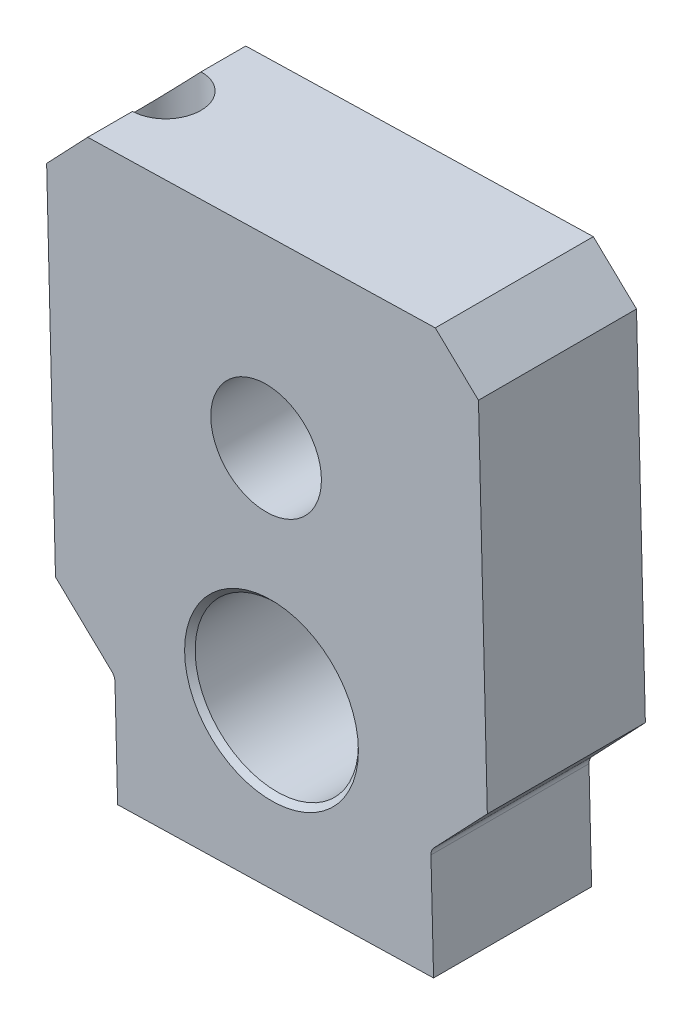
ISO-10303-21;
HEADER;
FILE_DESCRIPTION(('STEP AP214'),'2;1');
FILE_NAME('part.step','',(''),(''),'','','');
FILE_SCHEMA(('AUTOMOTIVE_DESIGN { 1 0 10303 214 1 1 1 1 }'));
ENDSEC;
DATA;
#1=APPLICATION_CONTEXT('core data for automotive mechanical design processes');
#2=APPLICATION_PROTOCOL_DEFINITION('international standard','automotive_design',2000,#1);
#3=PRODUCT_CONTEXT('',#1,'mechanical');
#4=PRODUCT('Part','Part','',(#3));
#5=PRODUCT_RELATED_PRODUCT_CATEGORY('part','',(#4));
#6=PRODUCT_DEFINITION_FORMATION('','',#4);
#7=PRODUCT_DEFINITION_CONTEXT('part definition',#1,'design');
#8=PRODUCT_DEFINITION('design','',#6,#7);
#9=PRODUCT_DEFINITION_SHAPE('','',#8);
#10=(LENGTH_UNIT() NAMED_UNIT(*) SI_UNIT(.MILLI.,.METRE.));
#11=(NAMED_UNIT(*) PLANE_ANGLE_UNIT() SI_UNIT($,.RADIAN.));
#12=(NAMED_UNIT(*) SI_UNIT($,.STERADIAN.) SOLID_ANGLE_UNIT());
#13=UNCERTAINTY_MEASURE_WITH_UNIT(LENGTH_MEASURE(1.E-05),#10,'distance_accuracy_value','');
#14=(GEOMETRIC_REPRESENTATION_CONTEXT(3) GLOBAL_UNCERTAINTY_ASSIGNED_CONTEXT((#13)) GLOBAL_UNIT_ASSIGNED_CONTEXT((#10,
#11,#12)) REPRESENTATION_CONTEXT('',''));
#15=CARTESIAN_POINT('',(0.,0.,0.));
#16=DIRECTION('',(0.,0.,1.));
#17=DIRECTION('',(1.,0.,0.));
#18=AXIS2_PLACEMENT_3D('',#15,#16,#17);
#19=CARTESIAN_POINT('',(0.,0.,15.));
#20=DIRECTION('',(0.,0.,-1.));
#21=DIRECTION('',(-1.,0.,0.));
#22=AXIS2_PLACEMENT_3D('',#19,#20,#21);
#23=CYLINDRICAL_SURFACE('',#22,5.25);
#24=CARTESIAN_POINT('',(0.,0.,15.));
#25=DIRECTION('',(0.,0.,1.));
#26=DIRECTION('',(1.,0.,0.));
#27=AXIS2_PLACEMENT_3D('',#24,#25,#26);
#28=CIRCLE('',#27,5.25);
#29=CARTESIAN_POINT('',(5.25,0.,15.));
#30=VERTEX_POINT('',#29);
#31=EDGE_CURVE('E418',#30,#30,#28,.T.);
#32=ORIENTED_EDGE('',*,*,#31,.T.);
#33=EDGE_LOOP('',(#32));
#34=FACE_BOUND('',#33,.T.);
#35=CARTESIAN_POINT('',(0.,0.,3.));
#36=DIRECTION('',(0.,0.,-1.));
#37=DIRECTION('',(-1.,0.,0.));
#38=AXIS2_PLACEMENT_3D('',#35,#36,#37);
#39=CIRCLE('',#38,5.25);
#40=CARTESIAN_POINT('',(-5.25,0.,3.));
#41=VERTEX_POINT('',#40);
#42=EDGE_CURVE('E160',#41,#41,#39,.T.);
#43=ORIENTED_EDGE('',*,*,#42,.T.);
#44=EDGE_LOOP('',(#43));
#45=FACE_BOUND('',#44,.T.);
#46=ADVANCED_FACE('F35',(#34,#45),#23,.F.);
#47=CARTESIAN_POINT('',(16.6452479800424,-25.5989320636449,15.));
#48=DIRECTION('',(0.,0.,1.));
#49=DIRECTION('',(1.,0.,0.));
#50=AXIS2_PLACEMENT_3D('',#47,#48,#49);
#51=PLANE('',#50);
#52=CARTESIAN_POINT('',(0.512556913680266,-20.4935913253493,15.));
#53=DIRECTION('',(0.,0.,1.));
#54=DIRECTION('',(1.,0.,0.));
#55=AXIS2_PLACEMENT_3D('',#52,#53,#54);
#56=CIRCLE('',#55,8.25000000000053);
#57=CARTESIAN_POINT('',(8.76255691368079,-20.4935913253493,15.));
#58=VERTEX_POINT('',#57);
#59=EDGE_CURVE('E181',#58,#58,#56,.F.);
#60=ORIENTED_EDGE('',*,*,#59,.T.);
#61=EDGE_LOOP('',(#60));
#62=FACE_BOUND('',#61,.T.);
#63=DIRECTION('',(-0.0250027762767222,0.999687381724135,0.));
#64=VECTOR('',#63,1.);
#65=CARTESIAN_POINT('',(20.9959694392361,-19.5740548992839,15.));
#66=LINE('',#65,#64);
#67=CARTESIAN_POINT('',(20.9959694392361,-19.5740548992839,15.));
#68=VERTEX_POINT('',#67);
#69=CARTESIAN_POINT('',(20.1560538455983,14.0083365671702,15.));
#70=VERTEX_POINT('',#69);
#71=EDGE_CURVE('E428',#68,#70,#66,.T.);
#72=ORIENTED_EDGE('',*,*,#71,.T.);
#73=DIRECTION('',(0.724565359337519,-0.689206094030002,0.));
#74=VECTOR('',#73,1.);
#75=CARTESIAN_POINT('',(38.091772734983,-3.05210746326916,15.));
#76=LINE('',#75,#74);
#77=CARTESIAN_POINT('',(16.0572932135961,17.9070749889587,15.));
#78=VERTEX_POINT('',#77);
#79=EDGE_CURVE('E170',#70,#78,#76,.F.);
#80=ORIENTED_EDGE('',*,*,#79,.T.);
#81=DIRECTION('',(-0.999687381724127,-0.0250027762770298,0.));
#82=VECTOR('',#81,1.);
#83=CARTESIAN_POINT('',(20.0560427404914,18.0070860940668,15.));
#84=LINE('',#83,#82);
#85=CARTESIAN_POINT('',(-16.9323903833129,17.0819833718164,15.));
#86=VERTEX_POINT('',#85);
#87=EDGE_CURVE('E432',#78,#86,#84,.T.);
#88=ORIENTED_EDGE('',*,*,#87,.T.);
#89=DIRECTION('',(0.689206094029778,0.724565359337732,0.));
#90=VECTOR('',#89,1.);
#91=CARTESIAN_POINT('',(-22.2966191483696,11.4425463784529,15.));
#92=LINE('',#91,#90);
#93=CARTESIAN_POINT('',(-20.8311288051013,12.9832227398118,15.));
#94=VERTEX_POINT('',#93);
#95=EDGE_CURVE('E151',#86,#94,#92,.F.);
#96=ORIENTED_EDGE('',*,*,#95,.T.);
#97=DIRECTION('',(0.0250027762770297,-0.999687381724127,0.));
#98=VECTOR('',#97,1.);
#99=CARTESIAN_POINT('',(-19.9912132114532,-20.5991687266389,15.));
#100=LINE('',#99,#98);
#101=CARTESIAN_POINT('',(-19.9912132114532,-20.5991687266389,15.));
#102=VERTEX_POINT('',#101);
#103=EDGE_CURVE('E434',#94,#102,#100,.T.);
#104=ORIENTED_EDGE('',*,*,#103,.T.);
#105=DIRECTION('',(0.724565359337678,-0.689206094029835,0.));
#106=VECTOR('',#105,1.);
#107=CARTESIAN_POINT('',(-14.6555421410993,-25.6744555451918,15.));
#108=LINE('',#107,#106);
#109=CARTESIAN_POINT('',(-14.6555421410993,-25.6744555451918,15.));
#110=VERTEX_POINT('',#109);
#111=EDGE_CURVE('E436',#102,#110,#108,.T.);
#112=ORIENTED_EDGE('',*,*,#111,.T.);
#113=CARTESIAN_POINT('',(-15.3447482351292,-26.3990209045295,15.));
#114=DIRECTION('',(0.,0.,-1.));
#115=DIRECTION('',(1.,0.,0.));
#116=AXIS2_PLACEMENT_3D('',#113,#114,#115);
#117=CIRCLE('',#116,1.);
#118=CARTESIAN_POINT('',(-14.345060853405,-26.3740181282526,15.));
#119=VERTEX_POINT('',#118);
#120=EDGE_CURVE('E438',#110,#119,#117,.T.);
#121=ORIENTED_EDGE('',*,*,#120,.T.);
#122=DIRECTION('',(0.0250027762769692,-0.999687381724129,0.));
#123=VECTOR('',#122,1.);
#124=CARTESIAN_POINT('',(-14.345060853405,-26.3740181282526,15.));
#125=LINE('',#124,#123);
#126=CARTESIAN_POINT('',(-14.0952107798901,-36.363787386228,15.));
#127=VERTEX_POINT('',#126);
#128=EDGE_CURVE('E440',#119,#127,#125,.T.);
#129=ORIENTED_EDGE('',*,*,#128,.T.);
#130=DIRECTION('',(0.999687381724129,0.0250027762769692,0.));
#131=VECTOR('',#130,1.);
#132=CARTESIAN_POINT('',(-14.0952107798901,-36.363787386228,15.));
#133=LINE('',#132,#131);
#134=CARTESIAN_POINT('',(15.8954106718337,-35.6137040979189,15.));
#135=VERTEX_POINT('',#134);
#136=EDGE_CURVE('E442',#127,#135,#133,.T.);
#137=ORIENTED_EDGE('',*,*,#136,.T.);
#138=DIRECTION('',(-0.0250027762769691,0.999687381724129,0.));
#139=VECTOR('',#138,1.);
#140=CARTESIAN_POINT('',(15.8954106718337,-35.6137040979189,15.));
#141=LINE('',#140,#139);
#142=CARTESIAN_POINT('',(15.6455605983183,-25.6239348399219,15.));
#143=VERTEX_POINT('',#142);
#144=EDGE_CURVE('E444',#135,#143,#141,.T.);
#145=ORIENTED_EDGE('',*,*,#144,.T.);
#146=CARTESIAN_POINT('',(16.6452479800424,-25.5989320636449,15.));
#147=DIRECTION('',(0.,0.,-1.));
#148=DIRECTION('',(1.,0.,0.));
#149=AXIS2_PLACEMENT_3D('',#146,#147,#148);
#150=CIRCLE('',#149,1.);
#151=CARTESIAN_POINT('',(15.9206826207047,-24.909725969615,15.));
#152=VERTEX_POINT('',#151);
#153=EDGE_CURVE('E446',#143,#152,#150,.T.);
#154=ORIENTED_EDGE('',*,*,#153,.T.);
#155=DIRECTION('',(0.689206094029835,0.724565359337678,0.));
#156=VECTOR('',#155,1.);
#157=CARTESIAN_POINT('',(20.9959694392361,-19.5740548992839,15.));
#158=LINE('',#157,#156);
#159=EDGE_CURVE('E425',#152,#68,#158,.T.);
#160=ORIENTED_EDGE('',*,*,#159,.T.);
#161=EDGE_LOOP('',(#72,#80,#88,#96,#104,#112,#121,#129,#137,#145,#154,#160));
#162=FACE_BOUND('',#161,.T.);
#163=ORIENTED_EDGE('',*,*,#31,.F.);
#164=EDGE_LOOP('',(#163));
#165=FACE_BOUND('',#164,.T.);
#166=ADVANCED_FACE('F201',(#62,#162,#165),#51,.T.);
#167=CARTESIAN_POINT('',(16.6452479800424,-25.5989320636449,0.));
#168=DIRECTION('',(0.,0.,1.));
#169=DIRECTION('',(1.,0.,0.));
#170=AXIS2_PLACEMENT_3D('',#167,#168,#169);
#171=PLANE('',#170);
#172=CARTESIAN_POINT('',(0.512556913680266,-20.4935913253493,0.));
#173=DIRECTION('',(0.,0.,1.));
#174=DIRECTION('',(1.,0.,0.));
#175=AXIS2_PLACEMENT_3D('',#172,#173,#174);
#176=CIRCLE('',#175,8.25000000000051);
#177=CARTESIAN_POINT('',(8.76255691368078,-20.4935913253493,0.));
#178=VERTEX_POINT('',#177);
#179=EDGE_CURVE('E44',#178,#178,#176,.T.);
#180=ORIENTED_EDGE('',*,*,#179,.T.);
#181=EDGE_LOOP('',(#180));
#182=FACE_BOUND('',#181,.T.);
#183=CARTESIAN_POINT('',(0.,0.,0.));
#184=DIRECTION('',(0.,0.,-1.));
#185=DIRECTION('',(-1.,0.,0.));
#186=AXIS2_PLACEMENT_3D('',#183,#184,#185);
#187=CIRCLE('',#186,11.15);
#188=CARTESIAN_POINT('',(-11.15,0.,0.));
#189=VERTEX_POINT('',#188);
#190=EDGE_CURVE('E416',#189,#189,#187,.T.);
#191=ORIENTED_EDGE('',*,*,#190,.F.);
#192=EDGE_LOOP('',(#191));
#193=FACE_BOUND('',#192,.T.);
#194=DIRECTION('',(-0.999687381724127,-0.0250027762770298,0.));
#195=VECTOR('',#194,1.);
#196=CARTESIAN_POINT('',(20.0560427404914,18.0070860940668,0.));
#197=LINE('',#196,#195);
#198=CARTESIAN_POINT('',(16.0572932135961,17.9070749889587,0.));
#199=VERTEX_POINT('',#198);
#200=CARTESIAN_POINT('',(-16.9323903833129,17.0819833718164,0.));
#201=VERTEX_POINT('',#200);
#202=EDGE_CURVE('E454',#199,#201,#197,.T.);
#203=ORIENTED_EDGE('',*,*,#202,.F.);
#204=DIRECTION('',(-0.724565359337519,0.689206094030002,0.));
#205=VECTOR('',#204,1.);
#206=CARTESIAN_POINT('',(16.0572932135961,17.9070749889587,0.));
#207=LINE('',#206,#205);
#208=CARTESIAN_POINT('',(20.1560538455983,14.0083365671702,0.));
#209=VERTEX_POINT('',#208);
#210=EDGE_CURVE('E165',#199,#209,#207,.F.);
#211=ORIENTED_EDGE('',*,*,#210,.T.);
#212=DIRECTION('',(-0.0250027762767222,0.999687381724135,0.));
#213=VECTOR('',#212,1.);
#214=CARTESIAN_POINT('',(20.9959694392361,-19.5740548992839,0.));
#215=LINE('',#214,#213);
#216=CARTESIAN_POINT('',(20.9959694392361,-19.5740548992839,0.));
#217=VERTEX_POINT('',#216);
#218=EDGE_CURVE('E451',#217,#209,#215,.T.);
#219=ORIENTED_EDGE('',*,*,#218,.F.);
#220=DIRECTION('',(0.689206094029835,0.724565359337678,0.));
#221=VECTOR('',#220,1.);
#222=CARTESIAN_POINT('',(20.9959694392361,-19.5740548992839,0.));
#223=LINE('',#222,#221);
#224=CARTESIAN_POINT('',(15.9206826207047,-24.909725969615,0.));
#225=VERTEX_POINT('',#224);
#226=EDGE_CURVE('E424',#225,#217,#223,.T.);
#227=ORIENTED_EDGE('',*,*,#226,.F.);
#228=CARTESIAN_POINT('',(16.6452479800424,-25.5989320636449,0.));
#229=DIRECTION('',(0.,0.,-1.));
#230=DIRECTION('',(1.,0.,0.));
#231=AXIS2_PLACEMENT_3D('',#228,#229,#230);
#232=CIRCLE('',#231,1.);
#233=CARTESIAN_POINT('',(15.6455605983183,-25.6239348399219,0.));
#234=VERTEX_POINT('',#233);
#235=EDGE_CURVE('E429',#234,#225,#232,.T.);
#236=ORIENTED_EDGE('',*,*,#235,.F.);
#237=DIRECTION('',(-0.0250027762769691,0.999687381724129,0.));
#238=VECTOR('',#237,1.);
#239=CARTESIAN_POINT('',(15.8954106718337,-35.6137040979189,0.));
#240=LINE('',#239,#238);
#241=CARTESIAN_POINT('',(15.8954106718337,-35.6137040979189,0.));
#242=VERTEX_POINT('',#241);
#243=EDGE_CURVE('E467',#242,#234,#240,.T.);
#244=ORIENTED_EDGE('',*,*,#243,.F.);
#245=DIRECTION('',(0.999687381724129,0.0250027762769692,0.));
#246=VECTOR('',#245,1.);
#247=CARTESIAN_POINT('',(-14.0952107798901,-36.363787386228,0.));
#248=LINE('',#247,#246);
#249=CARTESIAN_POINT('',(-14.0952107798901,-36.363787386228,0.));
#250=VERTEX_POINT('',#249);
#251=EDGE_CURVE('E465',#250,#242,#248,.T.);
#252=ORIENTED_EDGE('',*,*,#251,.F.);
#253=DIRECTION('',(0.0250027762769692,-0.999687381724129,0.));
#254=VECTOR('',#253,1.);
#255=CARTESIAN_POINT('',(-14.345060853405,-26.3740181282526,0.));
#256=LINE('',#255,#254);
#257=CARTESIAN_POINT('',(-14.345060853405,-26.3740181282526,0.));
#258=VERTEX_POINT('',#257);
#259=EDGE_CURVE('E463',#258,#250,#256,.T.);
#260=ORIENTED_EDGE('',*,*,#259,.F.);
#261=CARTESIAN_POINT('',(-15.3447482351292,-26.3990209045295,0.));
#262=DIRECTION('',(0.,0.,-1.));
#263=DIRECTION('',(1.,0.,0.));
#264=AXIS2_PLACEMENT_3D('',#261,#262,#263);
#265=CIRCLE('',#264,1.);
#266=CARTESIAN_POINT('',(-14.6555421410993,-25.6744555451918,0.));
#267=VERTEX_POINT('',#266);
#268=EDGE_CURVE('E461',#267,#258,#265,.T.);
#269=ORIENTED_EDGE('',*,*,#268,.F.);
#270=DIRECTION('',(0.724565359337678,-0.689206094029835,0.));
#271=VECTOR('',#270,1.);
#272=CARTESIAN_POINT('',(-14.6555421410993,-25.6744555451918,0.));
#273=LINE('',#272,#271);
#274=CARTESIAN_POINT('',(-19.9912132114532,-20.5991687266389,0.));
#275=VERTEX_POINT('',#274);
#276=EDGE_CURVE('E458',#275,#267,#273,.T.);
#277=ORIENTED_EDGE('',*,*,#276,.F.);
#278=DIRECTION('',(0.0250027762770297,-0.999687381724127,0.));
#279=VECTOR('',#278,1.);
#280=CARTESIAN_POINT('',(-19.9912132114532,-20.5991687266389,0.));
#281=LINE('',#280,#279);
#282=CARTESIAN_POINT('',(-20.8311288051013,12.9832227398118,0.));
#283=VERTEX_POINT('',#282);
#284=EDGE_CURVE('E456',#283,#275,#281,.T.);
#285=ORIENTED_EDGE('',*,*,#284,.F.);
#286=DIRECTION('',(-0.689206094029778,-0.724565359337732,0.));
#287=VECTOR('',#286,1.);
#288=CARTESIAN_POINT('',(-20.8311288051013,12.9832227398118,0.));
#289=LINE('',#288,#287);
#290=EDGE_CURVE('E163',#283,#201,#289,.F.);
#291=ORIENTED_EDGE('',*,*,#290,.T.);
#292=EDGE_LOOP('',(#203,#211,#219,#227,#236,#244,#252,#260,#269,#277,#285,#291));
#293=FACE_BOUND('',#292,.T.);
#294=ADVANCED_FACE('F186',(#182,#193,#293),#171,.F.);
#295=CARTESIAN_POINT('',(20.9959694392361,-19.5740548992839,15.));
#296=DIRECTION('',(-0.724565359337678,0.689206094029835,0.));
#297=DIRECTION('',(-0.689206094029835,-0.724565359337678,0.));
#298=AXIS2_PLACEMENT_3D('',#295,#296,#297);
#299=PLANE('',#298);
#300=ORIENTED_EDGE('',*,*,#226,.T.);
#301=DIRECTION('',(0.,0.,-1.));
#302=VECTOR('',#301,1.);
#303=CARTESIAN_POINT('',(20.9959694392361,-19.5740548992839,15.));
#304=LINE('',#303,#302);
#305=EDGE_CURVE('E152',#68,#217,#304,.T.);
#306=ORIENTED_EDGE('',*,*,#305,.F.);
#307=ORIENTED_EDGE('',*,*,#159,.F.);
#308=DIRECTION('',(0.,0.,-1.));
#309=VECTOR('',#308,1.);
#310=CARTESIAN_POINT('',(15.9206826207047,-24.909725969615,15.));
#311=LINE('',#310,#309);
#312=EDGE_CURVE('E448',#152,#225,#311,.T.);
#313=ORIENTED_EDGE('',*,*,#312,.T.);
#314=EDGE_LOOP('',(#300,#306,#307,#313));
#315=FACE_BOUND('',#314,.T.);
#316=ADVANCED_FACE('F222',(#315),#299,.F.);
#317=CARTESIAN_POINT('',(20.9959694392361,-19.5740548992839,15.));
#318=DIRECTION('',(-0.999687381724135,-0.0250027762767222,0.));
#319=DIRECTION('',(0.0250027762767222,-0.999687381724135,0.));
#320=AXIS2_PLACEMENT_3D('',#317,#318,#319);
#321=PLANE('',#320);
#322=ORIENTED_EDGE('',*,*,#218,.T.);
#323=DIRECTION('',(0.,0.,1.));
#324=VECTOR('',#323,1.);
#325=CARTESIAN_POINT('',(20.1560538455983,14.0083365671702,15.));
#326=LINE('',#325,#324);
#327=EDGE_CURVE('E167',#209,#70,#326,.T.);
#328=ORIENTED_EDGE('',*,*,#327,.T.);
#329=ORIENTED_EDGE('',*,*,#71,.F.);
#330=ORIENTED_EDGE('',*,*,#305,.T.);
#331=EDGE_LOOP('',(#322,#328,#329,#330));
#332=FACE_BOUND('',#331,.T.);
#333=ADVANCED_FACE('F252',(#332),#321,.F.);
#334=CARTESIAN_POINT('',(20.0560427404914,18.0070860940668,15.));
#335=DIRECTION('',(0.0250027762770298,-0.999687381724127,0.));
#336=DIRECTION('',(0.999687381724127,0.0250027762770298,0.));
#337=AXIS2_PLACEMENT_3D('',#334,#335,#336);
#338=PLANE('',#337);
#339=DIRECTION('',(0.,0.,1.));
#340=VECTOR('',#339,1.);
#341=CARTESIAN_POINT('',(-16.9323903833129,17.0819833718164,15.));
#342=LINE('',#341,#340);
#343=CARTESIAN_POINT('',(-16.9323903833129,17.0819833718164,4.24999999999999));
#344=VERTEX_POINT('',#343);
#345=EDGE_CURVE('E145',#201,#344,#342,.T.);
#346=ORIENTED_EDGE('',*,*,#345,.T.);
#347=CARTESIAN_POINT('',(-16.9323903833129,17.0819833718164,7.5));
#348=DIRECTION('',(-0.0250027762770299,0.999687381724127,0.));
#349=DIRECTION('',(-0.999687381724127,-0.0250027762770299,0.));
#350=AXIS2_PLACEMENT_3D('',#347,#348,#349);
#351=CIRCLE('',#350,3.25);
#352=CARTESIAN_POINT('',(-16.9323903833129,17.0819833718164,10.75));
#353=VERTEX_POINT('',#352);
#354=EDGE_CURVE('E56',#353,#344,#351,.T.);
#355=ORIENTED_EDGE('',*,*,#354,.F.);
#356=EDGE_CURVE('E142',#353,#86,#342,.T.);
#357=ORIENTED_EDGE('',*,*,#356,.T.);
#358=ORIENTED_EDGE('',*,*,#87,.F.);
#359=DIRECTION('',(0.,0.,-1.));
#360=VECTOR('',#359,1.);
#361=CARTESIAN_POINT('',(16.0572932135961,17.9070749889587,15.));
#362=LINE('',#361,#360);
#363=EDGE_CURVE('E154',#78,#199,#362,.T.);
#364=ORIENTED_EDGE('',*,*,#363,.T.);
#365=ORIENTED_EDGE('',*,*,#202,.T.);
#366=EDGE_LOOP('',(#346,#355,#357,#358,#364,#365));
#367=FACE_BOUND('',#366,.T.);
#368=ADVANCED_FACE('F140',(#367),#338,.F.);
#369=CARTESIAN_POINT('',(-19.9912132114532,-20.5991687266389,15.));
#370=DIRECTION('',(0.999687381724127,0.0250027762770298,0.));
#371=DIRECTION('',(-0.0250027762770298,0.999687381724127,0.));
#372=AXIS2_PLACEMENT_3D('',#369,#370,#371);
#373=PLANE('',#372);
#374=ORIENTED_EDGE('',*,*,#103,.F.);
#375=DIRECTION('',(0.,0.,-1.));
#376=VECTOR('',#375,1.);
#377=CARTESIAN_POINT('',(-20.8311288051013,12.9832227398118,15.));
#378=LINE('',#377,#376);
#379=EDGE_CURVE('E172',#94,#283,#378,.T.);
#380=ORIENTED_EDGE('',*,*,#379,.T.);
#381=ORIENTED_EDGE('',*,*,#284,.T.);
#382=DIRECTION('',(0.,0.,-1.));
#383=VECTOR('',#382,1.);
#384=CARTESIAN_POINT('',(-19.9912132114532,-20.5991687266389,15.));
#385=LINE('',#384,#383);
#386=EDGE_CURVE('E156',#102,#275,#385,.T.);
#387=ORIENTED_EDGE('',*,*,#386,.F.);
#388=EDGE_LOOP('',(#374,#380,#381,#387));
#389=FACE_BOUND('',#388,.T.);
#390=ADVANCED_FACE('F245',(#389),#373,.F.);
#391=CARTESIAN_POINT('',(-14.6555421410993,-25.6744555451918,15.));
#392=DIRECTION('',(0.689206094029835,0.724565359337678,0.));
#393=DIRECTION('',(-0.724565359337678,0.689206094029835,0.));
#394=AXIS2_PLACEMENT_3D('',#391,#392,#393);
#395=PLANE('',#394);
#396=DIRECTION('',(0.,0.,-1.));
#397=VECTOR('',#396,1.);
#398=CARTESIAN_POINT('',(-14.6555421410993,-25.6744555451918,15.));
#399=LINE('',#398,#397);
#400=CARTESIAN_POINT('',(-14.6555421410993,-25.6744555451918,4.48248558929908));
#401=VERTEX_POINT('',#400);
#402=EDGE_CURVE('E484',#401,#267,#399,.T.);
#403=ORIENTED_EDGE('',*,*,#402,.F.);
#404=CARTESIAN_POINT('',(-15.8924525794486,-24.4979071484279,7.5));
#405=DIRECTION('',(0.689206094029835,0.724565359337678,0.));
#406=DIRECTION('',(-0.724565359337678,0.689206094029835,0.));
#407=AXIS2_PLACEMENT_3D('',#404,#405,#406);
#408=ELLIPSE('',#407,4.59619407771293,3.25);
#409=CARTESIAN_POINT('',(-14.6555421410993,-25.6744555451918,10.5175144107009));
#410=VERTEX_POINT('',#409);
#411=EDGE_CURVE('E146',#410,#401,#408,.F.);
#412=ORIENTED_EDGE('',*,*,#411,.F.);
#413=EDGE_CURVE('E485',#110,#410,#399,.T.);
#414=ORIENTED_EDGE('',*,*,#413,.F.);
#415=ORIENTED_EDGE('',*,*,#111,.F.);
#416=ORIENTED_EDGE('',*,*,#386,.T.);
#417=ORIENTED_EDGE('',*,*,#276,.T.);
#418=EDGE_LOOP('',(#403,#412,#414,#415,#416,#417));
#419=FACE_BOUND('',#418,.T.);
#420=ADVANCED_FACE('F241',(#419),#395,.F.);
#421=CARTESIAN_POINT('',(-15.3447482351292,-26.3990209045295,15.));
#422=DIRECTION('',(0.,0.,-1.));
#423=DIRECTION('',(-1.,0.,0.));
#424=AXIS2_PLACEMENT_3D('',#421,#422,#423);
#425=CYLINDRICAL_SURFACE('',#424,1.);
#426=ORIENTED_EDGE('',*,*,#268,.T.);
#427=DIRECTION('',(0.,0.,-1.));
#428=VECTOR('',#427,1.);
#429=CARTESIAN_POINT('',(-14.345060853405,-26.3740181282526,15.));
#430=LINE('',#429,#428);
#431=EDGE_CURVE('E481',#119,#258,#430,.T.);
#432=ORIENTED_EDGE('',*,*,#431,.F.);
#433=ORIENTED_EDGE('',*,*,#120,.F.);
#434=ORIENTED_EDGE('',*,*,#413,.T.);
#435=EDGE_CURVE('E488',#410,#401,#399,.T.);
#436=ORIENTED_EDGE('',*,*,#435,.T.);
#437=ORIENTED_EDGE('',*,*,#402,.T.);
#438=EDGE_LOOP('',(#426,#432,#433,#434,#436,#437));
#439=FACE_BOUND('',#438,.T.);
#440=ADVANCED_FACE('F237',(#439),#425,.F.);
#441=CARTESIAN_POINT('',(-14.345060853405,-26.3740181282526,15.));
#442=DIRECTION('',(0.999687381724129,0.0250027762769692,0.));
#443=DIRECTION('',(-0.0250027762769692,0.999687381724129,0.));
#444=AXIS2_PLACEMENT_3D('',#441,#442,#443);
#445=PLANE('',#444);
#446=ORIENTED_EDGE('',*,*,#259,.T.);
#447=DIRECTION('',(0.,0.,-1.));
#448=VECTOR('',#447,1.);
#449=CARTESIAN_POINT('',(-14.0952107798901,-36.363787386228,15.));
#450=LINE('',#449,#448);
#451=EDGE_CURVE('E478',#127,#250,#450,.T.);
#452=ORIENTED_EDGE('',*,*,#451,.F.);
#453=ORIENTED_EDGE('',*,*,#128,.F.);
#454=ORIENTED_EDGE('',*,*,#431,.T.);
#455=EDGE_LOOP('',(#446,#452,#453,#454));
#456=FACE_BOUND('',#455,.T.);
#457=ADVANCED_FACE('F233',(#456),#445,.F.);
#458=CARTESIAN_POINT('',(-14.0952107798901,-36.363787386228,15.));
#459=DIRECTION('',(-0.0250027762769692,0.999687381724129,0.));
#460=DIRECTION('',(-0.999687381724129,-0.0250027762769692,0.));
#461=AXIS2_PLACEMENT_3D('',#458,#459,#460);
#462=PLANE('',#461);
#463=ORIENTED_EDGE('',*,*,#251,.T.);
#464=DIRECTION('',(0.,0.,-1.));
#465=VECTOR('',#464,1.);
#466=CARTESIAN_POINT('',(15.8954106718337,-35.6137040979189,15.));
#467=LINE('',#466,#465);
#468=EDGE_CURVE('E475',#135,#242,#467,.T.);
#469=ORIENTED_EDGE('',*,*,#468,.F.);
#470=ORIENTED_EDGE('',*,*,#136,.F.);
#471=ORIENTED_EDGE('',*,*,#451,.T.);
#472=EDGE_LOOP('',(#463,#469,#470,#471));
#473=FACE_BOUND('',#472,.T.);
#474=ADVANCED_FACE('F229',(#473),#462,.F.);
#475=CARTESIAN_POINT('',(15.8954106718337,-35.6137040979189,15.));
#476=DIRECTION('',(-0.999687381724129,-0.0250027762769691,0.));
#477=DIRECTION('',(0.0250027762769691,-0.999687381724129,0.));
#478=AXIS2_PLACEMENT_3D('',#475,#476,#477);
#479=PLANE('',#478);
#480=ORIENTED_EDGE('',*,*,#243,.T.);
#481=DIRECTION('',(0.,0.,-1.));
#482=VECTOR('',#481,1.);
#483=CARTESIAN_POINT('',(15.6455605983183,-25.6239348399219,15.));
#484=LINE('',#483,#482);
#485=EDGE_CURVE('E472',#143,#234,#484,.T.);
#486=ORIENTED_EDGE('',*,*,#485,.F.);
#487=ORIENTED_EDGE('',*,*,#144,.F.);
#488=ORIENTED_EDGE('',*,*,#468,.T.);
#489=EDGE_LOOP('',(#480,#486,#487,#488));
#490=FACE_BOUND('',#489,.T.);
#491=ADVANCED_FACE('F225',(#490),#479,.F.);
#492=CARTESIAN_POINT('',(16.6452479800424,-25.5989320636449,15.));
#493=DIRECTION('',(0.,0.,-1.));
#494=DIRECTION('',(-1.,0.,0.));
#495=AXIS2_PLACEMENT_3D('',#492,#493,#494);
#496=CYLINDRICAL_SURFACE('',#495,1.);
#497=ORIENTED_EDGE('',*,*,#235,.T.);
#498=ORIENTED_EDGE('',*,*,#312,.F.);
#499=ORIENTED_EDGE('',*,*,#153,.F.);
#500=ORIENTED_EDGE('',*,*,#485,.T.);
#501=EDGE_LOOP('',(#497,#498,#499,#500));
#502=FACE_BOUND('',#501,.T.);
#503=ADVANCED_FACE('F217',(#502),#496,.F.);
#504=CARTESIAN_POINT('',(0.512556913680266,-20.4935913253493,15.));
#505=DIRECTION('',(0.,0.,-1.));
#506=DIRECTION('',(-1.,0.,0.));
#507=AXIS2_PLACEMENT_3D('',#504,#505,#506);
#508=CYLINDRICAL_SURFACE('',#507,7.75000000000051);
#509=CARTESIAN_POINT('',(0.512556913680266,-20.4935913253493,14.5));
#510=DIRECTION('',(0.,0.,1.));
#511=DIRECTION('',(1.,0.,0.));
#512=AXIS2_PLACEMENT_3D('',#509,#510,#511);
#513=CIRCLE('',#512,7.75000000000051);
#514=CARTESIAN_POINT('',(8.26255691368078,-20.4935913253493,14.5));
#515=VERTEX_POINT('',#514);
#516=EDGE_CURVE('E178',#515,#515,#513,.T.);
#517=ORIENTED_EDGE('',*,*,#516,.T.);
#518=EDGE_LOOP('',(#517));
#519=FACE_BOUND('',#518,.T.);
#520=CARTESIAN_POINT('',(0.512556913680266,-20.4935913253493,0.500000000000002));
#521=DIRECTION('',(0.,0.,1.));
#522=DIRECTION('',(1.,0.,0.));
#523=AXIS2_PLACEMENT_3D('',#520,#521,#522);
#524=CIRCLE('',#523,7.75000000000051);
#525=CARTESIAN_POINT('',(8.26255691368078,-20.4935913253493,0.500000000000002));
#526=VERTEX_POINT('',#525);
#527=EDGE_CURVE('E175',#526,#526,#524,.F.);
#528=ORIENTED_EDGE('',*,*,#527,.T.);
#529=EDGE_LOOP('',(#528));
#530=FACE_BOUND('',#529,.T.);
#531=ADVANCED_FACE('F215',(#519,#530),#508,.F.);
#532=CARTESIAN_POINT('',(0.,0.,3.));
#533=DIRECTION('',(0.,0.,-1.));
#534=DIRECTION('',(-1.,0.,0.));
#535=AXIS2_PLACEMENT_3D('',#532,#533,#534);
#536=CYLINDRICAL_SURFACE('',#535,11.15);
#537=CARTESIAN_POINT('',(0.,0.,3.));
#538=DIRECTION('',(0.,0.,-1.));
#539=DIRECTION('',(-1.,0.,0.));
#540=AXIS2_PLACEMENT_3D('',#537,#538,#539);
#541=CIRCLE('',#540,11.15);
#542=CARTESIAN_POINT('',(-11.15,0.,3.));
#543=VERTEX_POINT('',#542);
#544=EDGE_CURVE('E415',#543,#543,#541,.T.);
#545=ORIENTED_EDGE('',*,*,#544,.F.);
#546=EDGE_LOOP('',(#545));
#547=FACE_BOUND('',#546,.T.);
#548=ORIENTED_EDGE('',*,*,#190,.T.);
#549=EDGE_LOOP('',(#548));
#550=FACE_BOUND('',#549,.T.);
#551=ADVANCED_FACE('F213',(#547,#550),#536,.F.);
#552=CARTESIAN_POINT('',(0.,0.,3.));
#553=DIRECTION('',(0.,0.,-1.));
#554=DIRECTION('',(-1.,0.,0.));
#555=AXIS2_PLACEMENT_3D('',#552,#553,#554);
#556=PLANE('',#555);
#557=ORIENTED_EDGE('',*,*,#42,.F.);
#558=EDGE_LOOP('',(#557));
#559=FACE_BOUND('',#558,.T.);
#560=ORIENTED_EDGE('',*,*,#544,.T.);
#561=EDGE_LOOP('',(#560));
#562=FACE_BOUND('',#561,.T.);
#563=ADVANCED_FACE('F266',(#559,#562),#556,.T.);
#564=CARTESIAN_POINT('',(16.0572932135961,17.9070749889587,15.));
#565=DIRECTION('',(-0.689206094030002,-0.724565359337519,0.));
#566=DIRECTION('',(0.,0.,-1.));
#567=AXIS2_PLACEMENT_3D('',#564,#565,#566);
#568=PLANE('',#567);
#569=ORIENTED_EDGE('',*,*,#79,.F.);
#570=ORIENTED_EDGE('',*,*,#327,.F.);
#571=ORIENTED_EDGE('',*,*,#210,.F.);
#572=ORIENTED_EDGE('',*,*,#363,.F.);
#573=EDGE_LOOP('',(#569,#570,#571,#572));
#574=FACE_BOUND('',#573,.T.);
#575=ADVANCED_FACE('F260',(#574),#568,.F.);
#576=CARTESIAN_POINT('',(-20.8311288051013,12.9832227398118,15.));
#577=DIRECTION('',(0.724565359337732,-0.689206094029778,0.));
#578=DIRECTION('',(0.,0.,-1.));
#579=AXIS2_PLACEMENT_3D('',#576,#577,#578);
#580=PLANE('',#579);
#581=CARTESIAN_POINT('',(-16.9323903833129,17.0819833718164,7.5));
#582=DIRECTION('',(0.724565359337732,-0.689206094029778,0.));
#583=DIRECTION('',(0.689206094029778,0.724565359337732,0.));
#584=AXIS2_PLACEMENT_3D('',#581,#582,#583);
#585=ELLIPSE('',#584,4.59619407771256,3.25);
#586=EDGE_CURVE('E11',#344,#353,#585,.F.);
#587=ORIENTED_EDGE('',*,*,#586,.F.);
#588=ORIENTED_EDGE('',*,*,#345,.F.);
#589=ORIENTED_EDGE('',*,*,#290,.F.);
#590=ORIENTED_EDGE('',*,*,#379,.F.);
#591=ORIENTED_EDGE('',*,*,#95,.F.);
#592=ORIENTED_EDGE('',*,*,#356,.F.);
#593=EDGE_LOOP('',(#587,#588,#589,#590,#591,#592));
#594=FACE_BOUND('',#593,.T.);
#595=ADVANCED_FACE('F149',(#594),#580,.F.);
#596=CARTESIAN_POINT('',(0.512556913680266,-20.4935913253493,14.5));
#597=DIRECTION('',(0.,0.,1.));
#598=DIRECTION('',(1.,0.,0.));
#599=AXIS2_PLACEMENT_3D('',#596,#597,#598);
#600=CONICAL_SURFACE('',#599,7.75000000000051,0.785398163397456);
#601=ORIENTED_EDGE('',*,*,#59,.F.);
#602=EDGE_LOOP('',(#601));
#603=FACE_BOUND('',#602,.T.);
#604=ORIENTED_EDGE('',*,*,#516,.F.);
#605=EDGE_LOOP('',(#604));
#606=FACE_BOUND('',#605,.T.);
#607=ADVANCED_FACE('F191',(#603,#606),#600,.F.);
#608=CARTESIAN_POINT('',(0.512556913680266,-20.4935913253493,0.));
#609=DIRECTION('',(0.,0.,-1.));
#610=DIRECTION('',(-1.,0.,0.));
#611=AXIS2_PLACEMENT_3D('',#608,#609,#610);
#612=CONICAL_SURFACE('',#611,8.25000000000051,0.785398163397447);
#613=ORIENTED_EDGE('',*,*,#527,.F.);
#614=EDGE_LOOP('',(#613));
#615=FACE_BOUND('',#614,.T.);
#616=ORIENTED_EDGE('',*,*,#179,.F.);
#617=EDGE_LOOP('',(#616));
#618=FACE_BOUND('',#617,.T.);
#619=ADVANCED_FACE('F38',(#615,#618),#612,.F.);
#620=CARTESIAN_POINT('',(-14.6555421410993,-25.6744555451918,15.));
#621=DIRECTION('',(0.689206094029835,0.724565359337678,0.));
#622=DIRECTION('',(-0.724565359337678,0.689206094029835,0.));
#623=AXIS2_PLACEMENT_3D('',#620,#621,#622);
#624=PLANE('',#623);
#625=ORIENTED_EDGE('',*,*,#435,.F.);
#626=EDGE_CURVE('E50',#401,#410,#408,.F.);
#627=ORIENTED_EDGE('',*,*,#626,.F.);
#628=EDGE_LOOP('',(#625,#627));
#629=FACE_BOUND('',#628,.T.);
#630=ADVANCED_FACE('F190',(#629),#624,.T.);
#631=CARTESIAN_POINT('',(-15.615016921397,-35.5906323530797,7.5));
#632=DIRECTION('',(-0.0250027762770299,0.999687381724127,0.));
#633=DIRECTION('',(-0.999687381724127,-0.0250027762770299,0.));
#634=AXIS2_PLACEMENT_3D('',#631,#632,#633);
#635=CYLINDRICAL_SURFACE('',#634,3.25);
#636=ORIENTED_EDGE('',*,*,#586,.T.);
#637=ORIENTED_EDGE('',*,*,#354,.T.);
#638=EDGE_LOOP('',(#636,#637));
#639=FACE_BOUND('',#638,.T.);
#640=ORIENTED_EDGE('',*,*,#626,.T.);
#641=ORIENTED_EDGE('',*,*,#411,.T.);
#642=EDGE_LOOP('',(#640,#641));
#643=FACE_BOUND('',#642,.T.);
#644=ADVANCED_FACE('F133',(#639,#643),#635,.F.);
#645=CLOSED_SHELL('',(#46,#166,#294,#316,#333,#368,#390,#420,#440,#457,#474,#491,#503,#531,#551,
#563,#575,#595,#607,#619,#630,#644));
#646=MANIFOLD_SOLID_BREP('B2',#645);
#647=ADVANCED_BREP_SHAPE_REPRESENTATION('',(#18,#646),#14);
#648=SHAPE_DEFINITION_REPRESENTATION(#9,#647);
ENDSEC;
END-ISO-10303-21;
